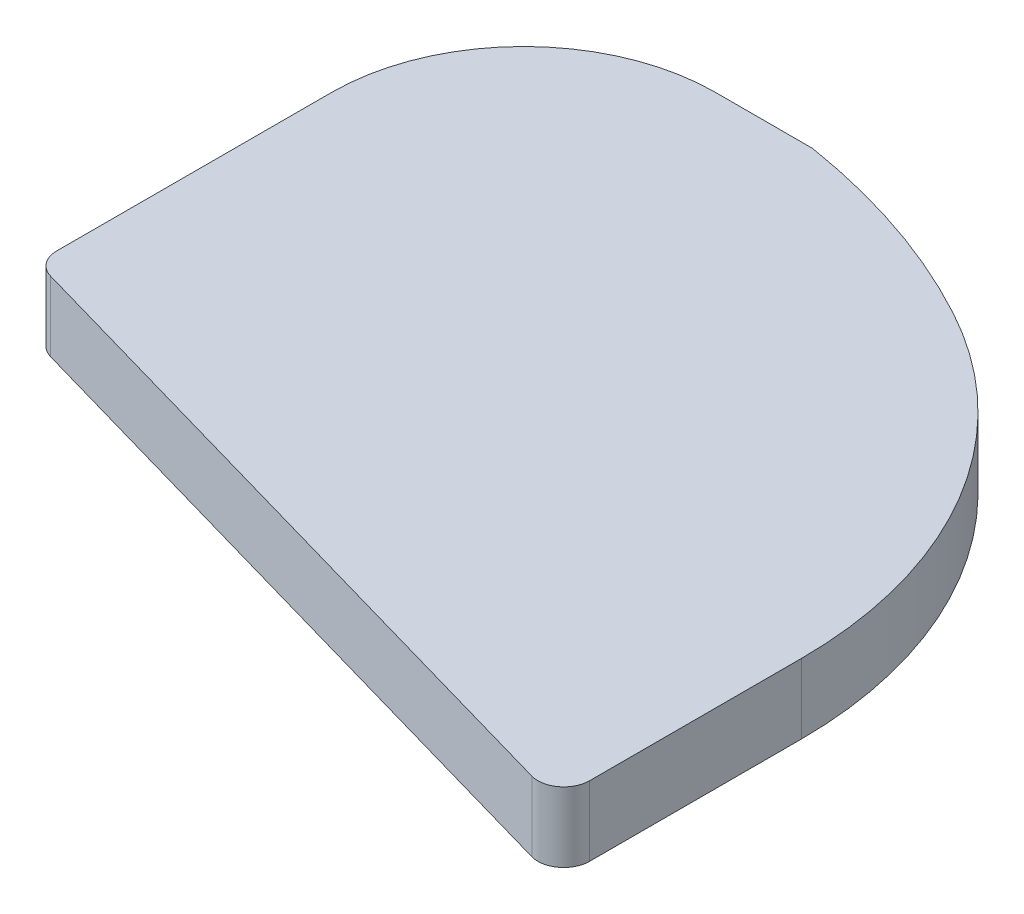
ISO-10303-21;
HEADER;
FILE_DESCRIPTION(('STEP AP214'),'2;1');
FILE_NAME('part.step','',(''),(''),'','','');
FILE_SCHEMA(('AUTOMOTIVE_DESIGN { 1 0 10303 214 1 1 1 1 }'));
ENDSEC;
DATA;
#1=APPLICATION_CONTEXT('core data for automotive mechanical design processes');
#2=APPLICATION_PROTOCOL_DEFINITION('international standard','automotive_design',2000,#1);
#3=PRODUCT_CONTEXT('',#1,'mechanical');
#4=PRODUCT('Part','Part','',(#3));
#5=PRODUCT_RELATED_PRODUCT_CATEGORY('part','',(#4));
#6=PRODUCT_DEFINITION_FORMATION('','',#4);
#7=PRODUCT_DEFINITION_CONTEXT('part definition',#1,'design');
#8=PRODUCT_DEFINITION('design','',#6,#7);
#9=PRODUCT_DEFINITION_SHAPE('','',#8);
#10=(LENGTH_UNIT() NAMED_UNIT(*) SI_UNIT(.MILLI.,.METRE.));
#11=(NAMED_UNIT(*) PLANE_ANGLE_UNIT() SI_UNIT($,.RADIAN.));
#12=(NAMED_UNIT(*) SI_UNIT($,.STERADIAN.) SOLID_ANGLE_UNIT());
#13=UNCERTAINTY_MEASURE_WITH_UNIT(LENGTH_MEASURE(1.E-05),#10,'distance_accuracy_value','');
#14=(GEOMETRIC_REPRESENTATION_CONTEXT(3) GLOBAL_UNCERTAINTY_ASSIGNED_CONTEXT((#13)) GLOBAL_UNIT_ASSIGNED_CONTEXT((#10,
#11,#12)) REPRESENTATION_CONTEXT('',''));
#15=CARTESIAN_POINT('',(0.,0.,0.));
#16=DIRECTION('',(0.,0.,1.));
#17=DIRECTION('',(1.,0.,0.));
#18=AXIS2_PLACEMENT_3D('',#15,#16,#17);
#19=CARTESIAN_POINT('',(-1.6406421260323,2.9906,1.5075638515099));
#20=DIRECTION('',(0.,-1.,0.));
#21=DIRECTION('',(-1.,0.,0.));
#22=AXIS2_PLACEMENT_3D('',#19,#20,#21);
#23=CYLINDRICAL_SURFACE('',#22,0.022218322900695);
#24=CARTESIAN_POINT('',(-1.6406421260323,2.9906,1.5075638515099));
#25=DIRECTION('',(0.,1.,0.));
#26=DIRECTION('',(1.,0.,0.));
#27=AXIS2_PLACEMENT_3D('',#24,#25,#26);
#28=CIRCLE('',#27,0.022218322900695);
#29=CARTESIAN_POINT('',(-1.662860448933,2.9906,1.5075638515099));
#30=VERTEX_POINT('',#29);
#31=CARTESIAN_POINT('',(-1.6467433960758,2.9906,1.5289280359403));
#32=VERTEX_POINT('',#31);
#33=EDGE_CURVE('E11',#30,#32,#28,.T.);
#34=ORIENTED_EDGE('',*,*,#33,.F.);
#35=DIRECTION('',(0.,-1.,0.));
#36=VECTOR('',#35,1.);
#37=CARTESIAN_POINT('',(-1.662860448933,2.9906,1.5075638515099));
#38=LINE('',#37,#36);
#39=CARTESIAN_POINT('',(-1.662860448933,2.9306,1.5075638515099));
#40=VERTEX_POINT('',#39);
#41=EDGE_CURVE('E24',#30,#40,#38,.T.);
#42=ORIENTED_EDGE('',*,*,#41,.T.);
#43=CARTESIAN_POINT('',(-1.6406421260323,2.9306,1.5075638515099));
#44=DIRECTION('',(0.,1.,0.));
#45=DIRECTION('',(1.,0.,0.));
#46=AXIS2_PLACEMENT_3D('',#43,#44,#45);
#47=CIRCLE('',#46,0.022218322900695);
#48=CARTESIAN_POINT('',(-1.6467433960758,2.9306,1.5289280359403));
#49=VERTEX_POINT('',#48);
#50=EDGE_CURVE('E167',#40,#49,#47,.T.);
#51=ORIENTED_EDGE('',*,*,#50,.T.);
#52=DIRECTION('',(0.,-1.,0.));
#53=VECTOR('',#52,1.);
#54=CARTESIAN_POINT('',(-1.6467433960758,2.9906,1.5289280359403));
#55=LINE('',#54,#53);
#56=EDGE_CURVE('E164',#32,#49,#55,.T.);
#57=ORIENTED_EDGE('',*,*,#56,.F.);
#58=EDGE_LOOP('',(#34,#42,#51,#57));
#59=FACE_BOUND('',#58,.T.);
#60=ADVANCED_FACE('F17',(#59),#23,.T.);
#61=CARTESIAN_POINT('',(-1.0620010364404,2.9906,1.6728145100297));
#62=DIRECTION('',(0.,-1.,0.));
#63=DIRECTION('',(-1.,0.,0.));
#64=AXIS2_PLACEMENT_3D('',#61,#62,#63);
#65=CYLINDRICAL_SURFACE('',#64,0.022218322900713);
#66=CARTESIAN_POINT('',(-1.0620010364404,2.9306,1.6728145100297));
#67=DIRECTION('',(0.,1.,0.));
#68=DIRECTION('',(1.,0.,0.));
#69=AXIS2_PLACEMENT_3D('',#66,#67,#68);
#70=CIRCLE('',#69,0.022218322900713);
#71=CARTESIAN_POINT('',(-1.0681023064839,2.9306,1.6941786944602));
#72=VERTEX_POINT('',#71);
#73=CARTESIAN_POINT('',(-1.0397827135397,2.9306,1.6728145100297));
#74=VERTEX_POINT('',#73);
#75=EDGE_CURVE('E162',#72,#74,#70,.T.);
#76=ORIENTED_EDGE('',*,*,#75,.T.);
#77=DIRECTION('',(0.,-1.,0.));
#78=VECTOR('',#77,1.);
#79=CARTESIAN_POINT('',(-1.0397827135397,2.9906,1.6728145100297));
#80=LINE('',#79,#78);
#81=CARTESIAN_POINT('',(-1.0397827135397,2.9906,1.6728145100297));
#82=VERTEX_POINT('',#81);
#83=EDGE_CURVE('E159',#82,#74,#80,.T.);
#84=ORIENTED_EDGE('',*,*,#83,.F.);
#85=CARTESIAN_POINT('',(-1.0620010364404,2.9906,1.6728145100297));
#86=DIRECTION('',(0.,1.,0.));
#87=DIRECTION('',(1.,0.,0.));
#88=AXIS2_PLACEMENT_3D('',#85,#86,#87);
#89=CIRCLE('',#88,0.022218322900713);
#90=CARTESIAN_POINT('',(-1.0681023064839,2.9906,1.6941786944602));
#91=VERTEX_POINT('',#90);
#92=EDGE_CURVE('E157',#91,#82,#89,.T.);
#93=ORIENTED_EDGE('',*,*,#92,.F.);
#94=DIRECTION('',(0.,-1.,0.));
#95=VECTOR('',#94,1.);
#96=CARTESIAN_POINT('',(-1.0681023064839,2.9906,1.6941786944602));
#97=LINE('',#96,#95);
#98=EDGE_CURVE('E154',#91,#72,#97,.T.);
#99=ORIENTED_EDGE('',*,*,#98,.T.);
#100=EDGE_LOOP('',(#76,#84,#93,#99));
#101=FACE_BOUND('',#100,.T.);
#102=ADVANCED_FACE('F182',(#101),#65,.T.);
#103=CARTESIAN_POINT('',(-1.0397827135397,2.9906,1.6728145100297));
#104=DIRECTION('',(-1.,0.,0.));
#105=DIRECTION('',(0.,1.,0.));
#106=AXIS2_PLACEMENT_3D('',#103,#104,#105);
#107=PLANE('',#106);
#108=DIRECTION('',(0.,0.,-1.));
#109=VECTOR('',#108,1.);
#110=CARTESIAN_POINT('',(-1.0397827135397,2.9306,1.6728145100297));
#111=LINE('',#110,#109);
#112=CARTESIAN_POINT('',(-1.0397827135397,2.9306,1.4909724960663));
#113=VERTEX_POINT('',#112);
#114=EDGE_CURVE('E152',#74,#113,#111,.T.);
#115=ORIENTED_EDGE('',*,*,#114,.T.);
#116=DIRECTION('',(0.,-1.,0.));
#117=VECTOR('',#116,1.);
#118=CARTESIAN_POINT('',(-1.0397827135397,2.9906,1.4909724960663));
#119=LINE('',#118,#117);
#120=CARTESIAN_POINT('',(-1.0397827135397,2.9906,1.4909724960663));
#121=VERTEX_POINT('',#120);
#122=EDGE_CURVE('E149',#121,#113,#119,.T.);
#123=ORIENTED_EDGE('',*,*,#122,.F.);
#124=DIRECTION('',(0.,0.,-1.));
#125=VECTOR('',#124,1.);
#126=CARTESIAN_POINT('',(-1.0397827135397,2.9906,1.6728145100297));
#127=LINE('',#126,#125);
#128=EDGE_CURVE('E146',#82,#121,#127,.T.);
#129=ORIENTED_EDGE('',*,*,#128,.F.);
#130=ORIENTED_EDGE('',*,*,#83,.T.);
#131=EDGE_LOOP('',(#115,#123,#129,#130));
#132=FACE_BOUND('',#131,.T.);
#133=ADVANCED_FACE('F184',(#132),#107,.F.);
#134=CARTESIAN_POINT('',(-1.4064152425379,2.9906,1.4909724960648));
#135=DIRECTION('',(0.,-1.,0.));
#136=DIRECTION('',(-1.,0.,0.));
#137=AXIS2_PLACEMENT_3D('',#134,#135,#136);
#138=CYLINDRICAL_SURFACE('',#137,0.366632528998205);
#139=CARTESIAN_POINT('',(-1.4064152425379,2.9306,1.4909724960648));
#140=DIRECTION('',(0.,1.,0.));
#141=DIRECTION('',(1.,0.,0.));
#142=AXIS2_PLACEMENT_3D('',#139,#140,#141);
#143=CIRCLE('',#142,0.366632528998205);
#144=CARTESIAN_POINT('',(-1.2313739423862,2.9306,1.1688235327562));
#145=VERTEX_POINT('',#144);
#146=EDGE_CURVE('E144',#113,#145,#143,.T.);
#147=ORIENTED_EDGE('',*,*,#146,.T.);
#148=DIRECTION('',(0.,-1.,0.));
#149=VECTOR('',#148,1.);
#150=CARTESIAN_POINT('',(-1.2313739423862,2.9906,1.1688235327562));
#151=LINE('',#150,#149);
#152=CARTESIAN_POINT('',(-1.2313739423862,2.9906,1.1688235327562));
#153=VERTEX_POINT('',#152);
#154=EDGE_CURVE('E141',#153,#145,#151,.T.);
#155=ORIENTED_EDGE('',*,*,#154,.F.);
#156=CARTESIAN_POINT('',(-1.4064152425379,2.9906,1.4909724960648));
#157=DIRECTION('',(0.,1.,0.));
#158=DIRECTION('',(1.,0.,0.));
#159=AXIS2_PLACEMENT_3D('',#156,#157,#158);
#160=CIRCLE('',#159,0.366632528998205);
#161=EDGE_CURVE('E138',#121,#153,#160,.T.);
#162=ORIENTED_EDGE('',*,*,#161,.F.);
#163=ORIENTED_EDGE('',*,*,#122,.T.);
#164=EDGE_LOOP('',(#147,#155,#162,#163));
#165=FACE_BOUND('',#164,.T.);
#166=ADVANCED_FACE('F189',(#165),#138,.T.);
#167=CARTESIAN_POINT('',(-1.5038668290435,2.9906,1.6703240407495));
#168=DIRECTION('',(0.,-1.,0.));
#169=DIRECTION('',(-1.,0.,0.));
#170=AXIS2_PLACEMENT_3D('',#167,#168,#169);
#171=CYLINDRICAL_SURFACE('',#170,0.570749623562132);
#172=CARTESIAN_POINT('',(-1.5038668290435,2.9306,1.6703240407495));
#173=DIRECTION('',(0.,1.,0.));
#174=DIRECTION('',(1.,0.,0.));
#175=AXIS2_PLACEMENT_3D('',#172,#173,#174);
#176=CIRCLE('',#175,0.570749623562132);
#177=CARTESIAN_POINT('',(-1.4145053086262,2.9306,1.1066134310702));
#178=VERTEX_POINT('',#177);
#179=EDGE_CURVE('E136',#145,#178,#176,.T.);
#180=ORIENTED_EDGE('',*,*,#179,.T.);
#181=DIRECTION('',(0.,-1.,0.));
#182=VECTOR('',#181,1.);
#183=CARTESIAN_POINT('',(-1.4145053086262,2.9906,1.1066134310702));
#184=LINE('',#183,#182);
#185=CARTESIAN_POINT('',(-1.4145053086262,2.9906,1.1066134310702));
#186=VERTEX_POINT('',#185);
#187=EDGE_CURVE('E133',#186,#178,#184,.T.);
#188=ORIENTED_EDGE('',*,*,#187,.F.);
#189=CARTESIAN_POINT('',(-1.5038668290435,2.9906,1.6703240407495));
#190=DIRECTION('',(0.,1.,0.));
#191=DIRECTION('',(1.,0.,0.));
#192=AXIS2_PLACEMENT_3D('',#189,#190,#191);
#193=CIRCLE('',#192,0.570749623562132);
#194=EDGE_CURVE('E130',#153,#186,#193,.T.);
#195=ORIENTED_EDGE('',*,*,#194,.F.);
#196=ORIENTED_EDGE('',*,*,#154,.T.);
#197=EDGE_LOOP('',(#180,#188,#195,#196));
#198=FACE_BOUND('',#197,.T.);
#199=ADVANCED_FACE('F193',(#198),#171,.T.);
#200=CARTESIAN_POINT('',(-1.4145053086262,2.9906,1.1066134310702));
#201=DIRECTION('',(0.,0.,1.));
#202=DIRECTION('',(0.,-1.,0.));
#203=AXIS2_PLACEMENT_3D('',#200,#201,#202);
#204=PLANE('',#203);
#205=DIRECTION('',(-1.,0.,0.));
#206=VECTOR('',#205,1.);
#207=CARTESIAN_POINT('',(-1.4145053086262,2.9306,1.1066134310702));
#208=LINE('',#207,#206);
#209=CARTESIAN_POINT('',(-1.4978443019851,2.9306,1.1066134310702));
#210=VERTEX_POINT('',#209);
#211=EDGE_CURVE('E128',#178,#210,#208,.T.);
#212=ORIENTED_EDGE('',*,*,#211,.T.);
#213=DIRECTION('',(0.,-1.,0.));
#214=VECTOR('',#213,1.);
#215=CARTESIAN_POINT('',(-1.4978443019851,2.9906,1.1066134310702));
#216=LINE('',#215,#214);
#217=CARTESIAN_POINT('',(-1.4978443019851,2.9906,1.1066134310702));
#218=VERTEX_POINT('',#217);
#219=EDGE_CURVE('E125',#218,#210,#216,.T.);
#220=ORIENTED_EDGE('',*,*,#219,.F.);
#221=DIRECTION('',(-1.,0.,0.));
#222=VECTOR('',#221,1.);
#223=CARTESIAN_POINT('',(-1.4145053086262,2.9906,1.1066134310702));
#224=LINE('',#223,#222);
#225=EDGE_CURVE('E123',#186,#218,#224,.T.);
#226=ORIENTED_EDGE('',*,*,#225,.F.);
#227=ORIENTED_EDGE('',*,*,#187,.T.);
#228=EDGE_LOOP('',(#212,#220,#226,#227));
#229=FACE_BOUND('',#228,.T.);
#230=ADVANCED_FACE('F196',(#229),#204,.F.);
#231=CARTESIAN_POINT('',(-1.4978443019851,2.9906,1.2714733869937));
#232=DIRECTION('',(0.,-1.,0.));
#233=DIRECTION('',(-1.,0.,0.));
#234=AXIS2_PLACEMENT_3D('',#231,#232,#233);
#235=CYLINDRICAL_SURFACE('',#234,0.164859955923481);
#236=CARTESIAN_POINT('',(-1.4978443019851,2.9306,1.2714733869937));
#237=DIRECTION('',(0.,1.,0.));
#238=DIRECTION('',(1.,0.,0.));
#239=AXIS2_PLACEMENT_3D('',#236,#237,#238);
#240=CIRCLE('',#239,0.164859955923481);
#241=CARTESIAN_POINT('',(-1.6627042218452,2.9306,1.2713643419474));
#242=VERTEX_POINT('',#241);
#243=EDGE_CURVE('E121',#210,#242,#240,.T.);
#244=ORIENTED_EDGE('',*,*,#243,.T.);
#245=DIRECTION('',(0.,-1.,0.));
#246=VECTOR('',#245,1.);
#247=CARTESIAN_POINT('',(-1.6627042218452,2.9906,1.2713643419474));
#248=LINE('',#247,#246);
#249=CARTESIAN_POINT('',(-1.6627042218452,2.9906,1.2713643419474));
#250=VERTEX_POINT('',#249);
#251=EDGE_CURVE('E119',#250,#242,#248,.T.);
#252=ORIENTED_EDGE('',*,*,#251,.F.);
#253=CARTESIAN_POINT('',(-1.4978443019851,2.9906,1.2714733869937));
#254=DIRECTION('',(0.,1.,0.));
#255=DIRECTION('',(1.,0.,0.));
#256=AXIS2_PLACEMENT_3D('',#253,#254,#255);
#257=CIRCLE('',#256,0.164859955923481);
#258=EDGE_CURVE('E108',#218,#250,#257,.T.);
#259=ORIENTED_EDGE('',*,*,#258,.F.);
#260=ORIENTED_EDGE('',*,*,#219,.T.);
#261=EDGE_LOOP('',(#244,#252,#259,#260));
#262=FACE_BOUND('',#261,.T.);
#263=ADVANCED_FACE('F199',(#262),#235,.T.);
#264=CARTESIAN_POINT('',(-1.6627042218452,2.9906,1.2713643419474));
#265=DIRECTION('',(0.99999978124823,0.,0.000661440466929837));
#266=DIRECTION('',(0.000661440466929837,0.,-0.99999978124823));
#267=AXIS2_PLACEMENT_3D('',#264,#265,#266);
#268=PLANE('',#267);
#269=DIRECTION('',(-0.000661440466929837,0.,0.99999978124823));
#270=VECTOR('',#269,1.);
#271=CARTESIAN_POINT('',(-1.6627042218452,2.9306,1.2713643419474));
#272=LINE('',#271,#270);
#273=CARTESIAN_POINT('',(-1.6628604440727,2.9306,1.507549155412));
#274=VERTEX_POINT('',#273);
#275=EDGE_CURVE('E96',#242,#274,#272,.T.);
#276=ORIENTED_EDGE('',*,*,#275,.T.);
#277=DIRECTION('',(0.,-1.,0.));
#278=VECTOR('',#277,1.);
#279=CARTESIAN_POINT('',(-1.6628604440727,2.9906,1.507549155412));
#280=LINE('',#279,#278);
#281=CARTESIAN_POINT('',(-1.6628604440727,2.9906,1.507549155412));
#282=VERTEX_POINT('',#281);
#283=EDGE_CURVE('E90',#282,#274,#280,.T.);
#284=ORIENTED_EDGE('',*,*,#283,.F.);
#285=DIRECTION('',(-0.000661440466929837,0.,0.99999978124823));
#286=VECTOR('',#285,1.);
#287=CARTESIAN_POINT('',(-1.6627042218452,2.9906,1.2713643419474));
#288=LINE('',#287,#286);
#289=EDGE_CURVE('E94',#250,#282,#288,.T.);
#290=ORIENTED_EDGE('',*,*,#289,.F.);
#291=ORIENTED_EDGE('',*,*,#251,.T.);
#292=EDGE_LOOP('',(#276,#284,#290,#291));
#293=FACE_BOUND('',#292,.T.);
#294=ADVANCED_FACE('F92',(#293),#268,.F.);
#295=CARTESIAN_POINT('',(-1.6406421260323,2.9906,1.5075638515099));
#296=DIRECTION('',(0.,-1.,0.));
#297=DIRECTION('',(-1.,0.,0.));
#298=AXIS2_PLACEMENT_3D('',#295,#296,#297);
#299=CYLINDRICAL_SURFACE('',#298,0.022218322900695);
#300=ORIENTED_EDGE('',*,*,#41,.F.);
#301=CARTESIAN_POINT('',(-1.6406421260323,2.9906,1.5075638515099));
#302=DIRECTION('',(0.,1.,0.));
#303=DIRECTION('',(1.,0.,0.));
#304=AXIS2_PLACEMENT_3D('',#301,#302,#303);
#305=CIRCLE('',#304,0.022218322900695);
#306=EDGE_CURVE('E105',#282,#30,#305,.T.);
#307=ORIENTED_EDGE('',*,*,#306,.F.);
#308=ORIENTED_EDGE('',*,*,#283,.T.);
#309=CARTESIAN_POINT('',(-1.6406421260323,2.9306,1.5075638515099));
#310=DIRECTION('',(0.,1.,0.));
#311=DIRECTION('',(1.,0.,0.));
#312=AXIS2_PLACEMENT_3D('',#309,#310,#311);
#313=CIRCLE('',#312,0.022218322900695);
#314=EDGE_CURVE('E111',#274,#40,#313,.T.);
#315=ORIENTED_EDGE('',*,*,#314,.T.);
#316=EDGE_LOOP('',(#300,#307,#308,#315));
#317=FACE_BOUND('',#316,.T.);
#318=ADVANCED_FACE('F110',(#317),#299,.T.);
#319=CARTESIAN_POINT('',(-1.6467433960758,2.9906,1.5289280359403));
#320=DIRECTION('',(0.274605336809789,0.,-0.961557023267774));
#321=DIRECTION('',(-0.961557023267774,0.,-0.274605336809789));
#322=AXIS2_PLACEMENT_3D('',#319,#320,#321);
#323=PLANE('',#322);
#324=DIRECTION('',(0.961557023267774,0.,0.274605336809789));
#325=VECTOR('',#324,1.);
#326=CARTESIAN_POINT('',(-1.6467433960758,2.9306,1.5289280359403));
#327=LINE('',#326,#325);
#328=EDGE_CURVE('E113',#49,#72,#327,.T.);
#329=ORIENTED_EDGE('',*,*,#328,.T.);
#330=ORIENTED_EDGE('',*,*,#98,.F.);
#331=DIRECTION('',(0.961557023267774,0.,0.274605336809789));
#332=VECTOR('',#331,1.);
#333=CARTESIAN_POINT('',(-1.6467433960758,2.9906,1.5289280359403));
#334=LINE('',#333,#332);
#335=EDGE_CURVE('E176',#32,#91,#334,.T.);
#336=ORIENTED_EDGE('',*,*,#335,.F.);
#337=ORIENTED_EDGE('',*,*,#56,.T.);
#338=EDGE_LOOP('',(#329,#330,#336,#337));
#339=FACE_BOUND('',#338,.T.);
#340=ADVANCED_FACE('F180',(#339),#323,.F.);
#341=CARTESIAN_POINT('',(-1.0620010364404,2.9906,1.6728145100297));
#342=DIRECTION('',(0.,1.,0.));
#343=DIRECTION('',(1.,0.,0.));
#344=AXIS2_PLACEMENT_3D('',#341,#342,#343);
#345=PLANE('',#344);
#346=ORIENTED_EDGE('',*,*,#92,.T.);
#347=ORIENTED_EDGE('',*,*,#128,.T.);
#348=ORIENTED_EDGE('',*,*,#161,.T.);
#349=ORIENTED_EDGE('',*,*,#194,.T.);
#350=ORIENTED_EDGE('',*,*,#225,.T.);
#351=ORIENTED_EDGE('',*,*,#258,.T.);
#352=ORIENTED_EDGE('',*,*,#289,.T.);
#353=ORIENTED_EDGE('',*,*,#306,.T.);
#354=ORIENTED_EDGE('',*,*,#33,.T.);
#355=ORIENTED_EDGE('',*,*,#335,.T.);
#356=EDGE_LOOP('',(#346,#347,#348,#349,#350,#351,#352,#353,#354,#355));
#357=FACE_BOUND('',#356,.T.);
#358=ADVANCED_FACE('F104',(#357),#345,.T.);
#359=CARTESIAN_POINT('',(-1.0620010364404,2.9306,1.6728145100297));
#360=DIRECTION('',(0.,1.,0.));
#361=DIRECTION('',(1.,0.,0.));
#362=AXIS2_PLACEMENT_3D('',#359,#360,#361);
#363=PLANE('',#362);
#364=ORIENTED_EDGE('',*,*,#75,.F.);
#365=ORIENTED_EDGE('',*,*,#328,.F.);
#366=ORIENTED_EDGE('',*,*,#50,.F.);
#367=ORIENTED_EDGE('',*,*,#314,.F.);
#368=ORIENTED_EDGE('',*,*,#275,.F.);
#369=ORIENTED_EDGE('',*,*,#243,.F.);
#370=ORIENTED_EDGE('',*,*,#211,.F.);
#371=ORIENTED_EDGE('',*,*,#179,.F.);
#372=ORIENTED_EDGE('',*,*,#146,.F.);
#373=ORIENTED_EDGE('',*,*,#114,.F.);
#374=EDGE_LOOP('',(#364,#365,#366,#367,#368,#369,#370,#371,#372,#373));
#375=FACE_BOUND('',#374,.T.);
#376=ADVANCED_FACE('F171',(#375),#363,.F.);
#377=CLOSED_SHELL('',(#60,#102,#133,#166,#199,#230,#263,#294,#318,#340,#358,#376));
#378=MANIFOLD_SOLID_BREP('B1',#377);
#379=ADVANCED_BREP_SHAPE_REPRESENTATION('',(#18,#378),#14);
#380=SHAPE_DEFINITION_REPRESENTATION(#9,#379);
ENDSEC;
END-ISO-10303-21;
